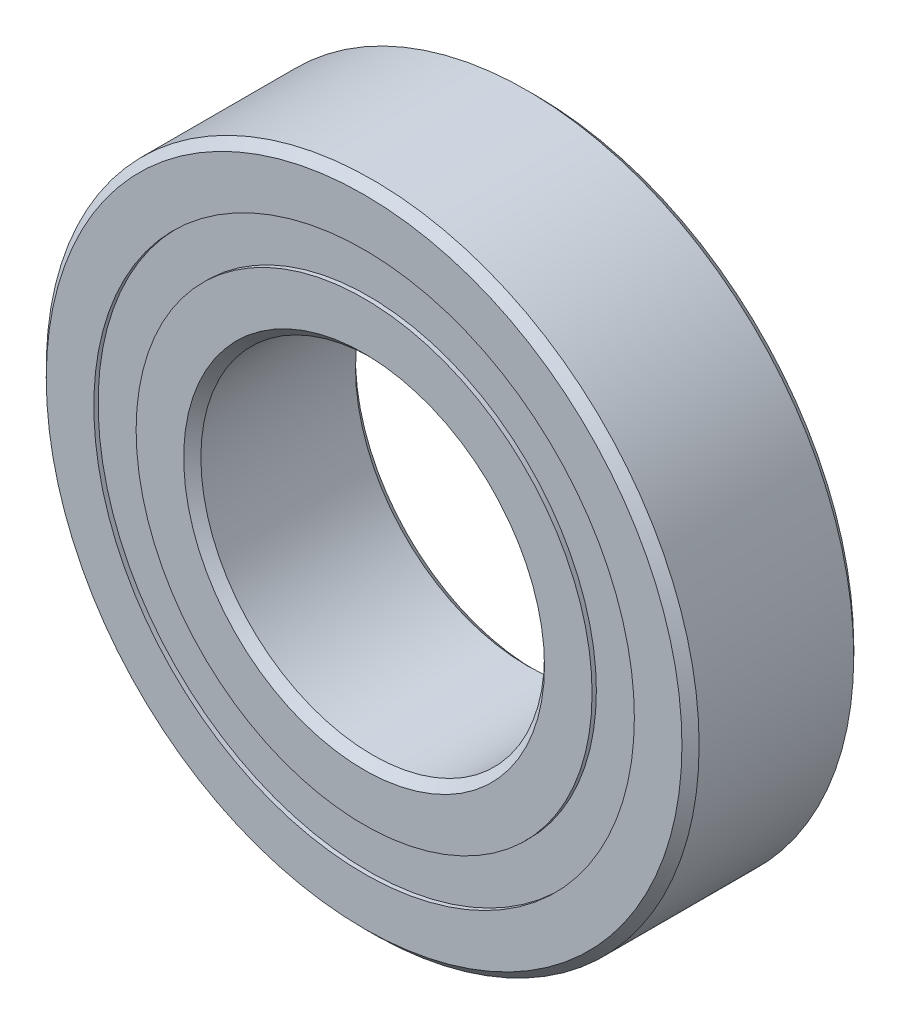
ISO-10303-21;
HEADER;
FILE_DESCRIPTION(('STEP AP214'),'2;1');
FILE_NAME('part.step','',(''),(''),'','','');
FILE_SCHEMA(('AUTOMOTIVE_DESIGN { 1 0 10303 214 1 1 1 1 }'));
ENDSEC;
DATA;
#1=APPLICATION_CONTEXT('core data for automotive mechanical design processes');
#2=APPLICATION_PROTOCOL_DEFINITION('international standard','automotive_design',2000,#1);
#3=PRODUCT_CONTEXT('',#1,'mechanical');
#4=PRODUCT('Part','Part','',(#3));
#5=PRODUCT_RELATED_PRODUCT_CATEGORY('part','',(#4));
#6=PRODUCT_DEFINITION_FORMATION('','',#4);
#7=PRODUCT_DEFINITION_CONTEXT('part definition',#1,'design');
#8=PRODUCT_DEFINITION('design','',#6,#7);
#9=PRODUCT_DEFINITION_SHAPE('','',#8);
#10=(LENGTH_UNIT() NAMED_UNIT(*) SI_UNIT(.MILLI.,.METRE.));
#11=(NAMED_UNIT(*) PLANE_ANGLE_UNIT() SI_UNIT($,.RADIAN.));
#12=(NAMED_UNIT(*) SI_UNIT($,.STERADIAN.) SOLID_ANGLE_UNIT());
#13=UNCERTAINTY_MEASURE_WITH_UNIT(LENGTH_MEASURE(1.E-05),#10,'distance_accuracy_value','');
#14=(GEOMETRIC_REPRESENTATION_CONTEXT(3) GLOBAL_UNCERTAINTY_ASSIGNED_CONTEXT((#13)) GLOBAL_UNIT_ASSIGNED_CONTEXT((#10,
#11,#12)) REPRESENTATION_CONTEXT('',''));
#15=CARTESIAN_POINT('',(0.,0.,0.));
#16=DIRECTION('',(0.,0.,1.));
#17=DIRECTION('',(1.,0.,0.));
#18=AXIS2_PLACEMENT_3D('',#15,#16,#17);
#19=CARTESIAN_POINT('',(0.,7.86538461538461,-2.375));
#20=DIRECTION('',(0.,0.,1.));
#21=DIRECTION('',(1.,0.,0.));
#22=AXIS2_PLACEMENT_3D('',#19,#20,#21);
#23=PLANE('',#22);
#24=CARTESIAN_POINT('',(0.,0.,-2.375));
#25=DIRECTION('',(0.,0.,1.));
#26=DIRECTION('',(1.,0.,0.));
#27=AXIS2_PLACEMENT_3D('',#24,#25,#26);
#28=CIRCLE('',#27,7.86538461538461);
#29=CARTESIAN_POINT('',(7.86538461538461,0.,-2.375));
#30=VERTEX_POINT('',#29);
#31=EDGE_CURVE('E61',#30,#30,#28,.T.);
#32=ORIENTED_EDGE('',*,*,#31,.F.);
#33=EDGE_LOOP('',(#32));
#34=FACE_BOUND('',#33,.T.);
#35=CARTESIAN_POINT('',(0.,0.,-2.375));
#36=DIRECTION('',(0.,0.,1.));
#37=DIRECTION('',(1.,0.,0.));
#38=AXIS2_PLACEMENT_3D('',#35,#36,#37);
#39=CIRCLE('',#38,6.63461538461539);
#40=CARTESIAN_POINT('',(6.63461538461539,0.,-2.375));
#41=VERTEX_POINT('',#40);
#42=EDGE_CURVE('E11',#41,#41,#39,.T.);
#43=ORIENTED_EDGE('',*,*,#42,.T.);
#44=EDGE_LOOP('',(#43));
#45=FACE_BOUND('',#44,.T.);
#46=ADVANCED_FACE('F47',(#34,#45),#23,.F.);
#47=CARTESIAN_POINT('',(0.,0.,2.5));
#48=DIRECTION('',(0.,0.,1.));
#49=DIRECTION('',(1.,0.,0.));
#50=AXIS2_PLACEMENT_3D('',#47,#48,#49);
#51=CYLINDRICAL_SURFACE('',#50,6.63461538461539);
#52=ORIENTED_EDGE('',*,*,#42,.F.);
#53=EDGE_LOOP('',(#52));
#54=FACE_BOUND('',#53,.T.);
#55=CARTESIAN_POINT('',(0.,0.,-1.2701441359494));
#56=DIRECTION('',(0.,0.,1.));
#57=DIRECTION('',(1.,0.,0.));
#58=AXIS2_PLACEMENT_3D('',#55,#56,#57);
#59=CIRCLE('',#58,6.63461538461539);
#60=CARTESIAN_POINT('',(6.63461538461539,0.,-1.2701441359494));
#61=VERTEX_POINT('',#60);
#62=EDGE_CURVE('E53',#61,#61,#59,.T.);
#63=ORIENTED_EDGE('',*,*,#62,.T.);
#64=EDGE_LOOP('',(#63));
#65=FACE_BOUND('',#64,.T.);
#66=ADVANCED_FACE('F70',(#54,#65),#51,.F.);
#67=CARTESIAN_POINT('',(0.,7.86538461538461,-1.2701441359494));
#68=DIRECTION('',(0.,0.,-1.));
#69=DIRECTION('',(-1.,0.,0.));
#70=AXIS2_PLACEMENT_3D('',#67,#68,#69);
#71=PLANE('',#70);
#72=ORIENTED_EDGE('',*,*,#62,.F.);
#73=EDGE_LOOP('',(#72));
#74=FACE_BOUND('',#73,.T.);
#75=CARTESIAN_POINT('',(0.,0.,-1.2701441359494));
#76=DIRECTION('',(0.,0.,1.));
#77=DIRECTION('',(1.,0.,0.));
#78=AXIS2_PLACEMENT_3D('',#75,#76,#77);
#79=CIRCLE('',#78,7.86538461538461);
#80=CARTESIAN_POINT('',(7.86538461538461,0.,-1.2701441359494));
#81=VERTEX_POINT('',#80);
#82=EDGE_CURVE('E57',#81,#81,#79,.T.);
#83=ORIENTED_EDGE('',*,*,#82,.T.);
#84=EDGE_LOOP('',(#83));
#85=FACE_BOUND('',#84,.T.);
#86=ADVANCED_FACE('F74',(#74,#85),#71,.F.);
#87=CARTESIAN_POINT('',(0.,0.,2.5));
#88=DIRECTION('',(0.,0.,1.));
#89=DIRECTION('',(1.,0.,0.));
#90=AXIS2_PLACEMENT_3D('',#87,#88,#89);
#91=CYLINDRICAL_SURFACE('',#90,7.86538461538461);
#92=ORIENTED_EDGE('',*,*,#82,.F.);
#93=EDGE_LOOP('',(#92));
#94=FACE_BOUND('',#93,.T.);
#95=ORIENTED_EDGE('',*,*,#31,.T.);
#96=EDGE_LOOP('',(#95));
#97=FACE_BOUND('',#96,.T.);
#98=ADVANCED_FACE('F67',(#94,#97),#91,.T.);
#99=CLOSED_SHELL('',(#46,#66,#86,#98));
#100=MANIFOLD_SOLID_BREP('B2',#99);
#101=CARTESIAN_POINT('',(0.,7.86538461538461,2.375));
#102=DIRECTION('',(0.,0.,-1.));
#103=DIRECTION('',(-1.,0.,0.));
#104=AXIS2_PLACEMENT_3D('',#101,#102,#103);
#105=PLANE('',#104);
#106=CARTESIAN_POINT('',(0.,0.,2.375));
#107=DIRECTION('',(0.,0.,1.));
#108=DIRECTION('',(1.,0.,0.));
#109=AXIS2_PLACEMENT_3D('',#106,#107,#108);
#110=CIRCLE('',#109,6.63461538461539);
#111=CARTESIAN_POINT('',(6.63461538461539,0.,2.375));
#112=VERTEX_POINT('',#111);
#113=EDGE_CURVE('E46',#112,#112,#110,.T.);
#114=ORIENTED_EDGE('',*,*,#113,.F.);
#115=EDGE_LOOP('',(#114));
#116=FACE_BOUND('',#115,.T.);
#117=CARTESIAN_POINT('',(0.,0.,2.375));
#118=DIRECTION('',(0.,0.,1.));
#119=DIRECTION('',(1.,0.,0.));
#120=AXIS2_PLACEMENT_3D('',#117,#118,#119);
#121=CIRCLE('',#120,7.86538461538461);
#122=CARTESIAN_POINT('',(7.86538461538461,0.,2.375));
#123=VERTEX_POINT('',#122);
#124=EDGE_CURVE('E152',#123,#123,#121,.T.);
#125=ORIENTED_EDGE('',*,*,#124,.T.);
#126=EDGE_LOOP('',(#125));
#127=FACE_BOUND('',#126,.T.);
#128=ADVANCED_FACE('F138',(#116,#127),#105,.F.);
#129=CARTESIAN_POINT('',(0.,0.,2.5));
#130=DIRECTION('',(0.,0.,1.));
#131=DIRECTION('',(1.,0.,0.));
#132=AXIS2_PLACEMENT_3D('',#129,#130,#131);
#133=CYLINDRICAL_SURFACE('',#132,6.63461538461539);
#134=CARTESIAN_POINT('',(0.,0.,1.27014413594939));
#135=DIRECTION('',(0.,0.,1.));
#136=DIRECTION('',(1.,0.,0.));
#137=AXIS2_PLACEMENT_3D('',#134,#135,#136);
#138=CIRCLE('',#137,6.63461538461539);
#139=CARTESIAN_POINT('',(6.63461538461539,0.,1.27014413594939));
#140=VERTEX_POINT('',#139);
#141=EDGE_CURVE('E144',#140,#140,#138,.T.);
#142=ORIENTED_EDGE('',*,*,#141,.F.);
#143=EDGE_LOOP('',(#142));
#144=FACE_BOUND('',#143,.T.);
#145=ORIENTED_EDGE('',*,*,#113,.T.);
#146=EDGE_LOOP('',(#145));
#147=FACE_BOUND('',#146,.T.);
#148=ADVANCED_FACE('F167',(#144,#147),#133,.F.);
#149=CARTESIAN_POINT('',(0.,7.86538461538461,1.27014413594939));
#150=DIRECTION('',(0.,0.,1.));
#151=DIRECTION('',(1.,0.,0.));
#152=AXIS2_PLACEMENT_3D('',#149,#150,#151);
#153=PLANE('',#152);
#154=CARTESIAN_POINT('',(0.,0.,1.27014413594939));
#155=DIRECTION('',(0.,0.,1.));
#156=DIRECTION('',(1.,0.,0.));
#157=AXIS2_PLACEMENT_3D('',#154,#155,#156);
#158=CIRCLE('',#157,7.86538461538461);
#159=CARTESIAN_POINT('',(7.86538461538461,0.,1.27014413594939));
#160=VERTEX_POINT('',#159);
#161=EDGE_CURVE('E148',#160,#160,#158,.T.);
#162=ORIENTED_EDGE('',*,*,#161,.F.);
#163=EDGE_LOOP('',(#162));
#164=FACE_BOUND('',#163,.T.);
#165=ORIENTED_EDGE('',*,*,#141,.T.);
#166=EDGE_LOOP('',(#165));
#167=FACE_BOUND('',#166,.T.);
#168=ADVANCED_FACE('F162',(#164,#167),#153,.F.);
#169=CARTESIAN_POINT('',(0.,0.,2.5));
#170=DIRECTION('',(0.,0.,1.));
#171=DIRECTION('',(1.,0.,0.));
#172=AXIS2_PLACEMENT_3D('',#169,#170,#171);
#173=CYLINDRICAL_SURFACE('',#172,7.86538461538461);
#174=ORIENTED_EDGE('',*,*,#124,.F.);
#175=EDGE_LOOP('',(#174));
#176=FACE_BOUND('',#175,.T.);
#177=ORIENTED_EDGE('',*,*,#161,.T.);
#178=EDGE_LOOP('',(#177));
#179=FACE_BOUND('',#178,.T.);
#180=ADVANCED_FACE('F159',(#176,#179),#173,.T.);
#181=CLOSED_SHELL('',(#128,#148,#168,#180));
#182=MANIFOLD_SOLID_BREP('B6',#181);
#183=CARTESIAN_POINT('',(-3.62499999999992,6.27868417743723,0.));
#184=DIRECTION('',(0.,0.,1.));
#185=DIRECTION('',(0.499999999999989,-0.866025403784445,0.));
#186=AXIS2_PLACEMENT_3D('',#183,#184,#185);
#187=SPHERICAL_SURFACE('',#186,1.2701441359494);
#188=CARTESIAN_POINT('',(-3.62499999999992,6.27868417743723,1.27014413594939));
#189=VERTEX_POINT('',#188);
#190=VERTEX_LOOP('',#189);
#191=FACE_BOUND('',#190,.T.);
#192=ADVANCED_FACE('F229',(#191),#187,.T.);
#193=CLOSED_SHELL('',(#192));
#194=MANIFOLD_SOLID_BREP('B41',#193);
#195=CARTESIAN_POINT('',(-6.27868417743714,3.62500000000007,0.));
#196=DIRECTION('',(0.,0.,1.));
#197=DIRECTION('',(0.866025403784433,-0.50000000000001,0.));
#198=AXIS2_PLACEMENT_3D('',#195,#196,#197);
#199=SPHERICAL_SURFACE('',#198,1.2701441359494);
#200=CARTESIAN_POINT('',(-6.27868417743714,3.62500000000007,1.27014413594939));
#201=VERTEX_POINT('',#200);
#202=VERTEX_LOOP('',#201);
#203=FACE_BOUND('',#202,.T.);
#204=ADVANCED_FACE('F255',(#203),#199,.T.);
#205=CLOSED_SHELL('',(#204));
#206=MANIFOLD_SOLID_BREP('B134',#205);
#207=CARTESIAN_POINT('',(-7.25,0.,0.));
#208=DIRECTION('',(0.,0.,1.));
#209=DIRECTION('',(1.,0.,0.));
#210=AXIS2_PLACEMENT_3D('',#207,#208,#209);
#211=SPHERICAL_SURFACE('',#210,1.2701441359494);
#212=CARTESIAN_POINT('',(-7.25,0.,1.27014413594939));
#213=VERTEX_POINT('',#212);
#214=VERTEX_LOOP('',#213);
#215=FACE_BOUND('',#214,.T.);
#216=ADVANCED_FACE('F281',(#215),#211,.T.);
#217=CLOSED_SHELL('',(#216));
#218=MANIFOLD_SOLID_BREP('B225',#217);
#219=CARTESIAN_POINT('',(-6.27868417743721,-3.62499999999994,0.));
#220=DIRECTION('',(0.,0.,1.));
#221=DIRECTION('',(0.866025403784443,0.499999999999992,0.));
#222=AXIS2_PLACEMENT_3D('',#219,#220,#221);
#223=SPHERICAL_SURFACE('',#222,1.2701441359494);
#224=CARTESIAN_POINT('',(-6.27868417743721,-3.62499999999994,1.27014413594939));
#225=VERTEX_POINT('',#224);
#226=VERTEX_LOOP('',#225);
#227=FACE_BOUND('',#226,.T.);
#228=ADVANCED_FACE('F307',(#227),#223,.T.);
#229=CLOSED_SHELL('',(#228));
#230=MANIFOLD_SOLID_BREP('B251',#229);
#231=CARTESIAN_POINT('',(-3.62500000000005,-6.27868417743715,0.));
#232=DIRECTION('',(0.,0.,1.));
#233=DIRECTION('',(0.500000000000007,0.866025403784435,0.));
#234=AXIS2_PLACEMENT_3D('',#231,#232,#233);
#235=SPHERICAL_SURFACE('',#234,1.2701441359494);
#236=CARTESIAN_POINT('',(-3.62500000000005,-6.27868417743715,1.27014413594939));
#237=VERTEX_POINT('',#236);
#238=VERTEX_LOOP('',#237);
#239=FACE_BOUND('',#238,.T.);
#240=ADVANCED_FACE('F333',(#239),#235,.T.);
#241=CLOSED_SHELL('',(#240));
#242=MANIFOLD_SOLID_BREP('B277',#241);
#243=CARTESIAN_POINT('',(0.,-7.25,0.));
#244=DIRECTION('',(0.,0.,1.));
#245=DIRECTION('',(0.,1.,0.));
#246=AXIS2_PLACEMENT_3D('',#243,#244,#245);
#247=SPHERICAL_SURFACE('',#246,1.2701441359494);
#248=CARTESIAN_POINT('',(0.,-7.25,1.27014413594939));
#249=VERTEX_POINT('',#248);
#250=VERTEX_LOOP('',#249);
#251=FACE_BOUND('',#250,.T.);
#252=ADVANCED_FACE('F359',(#251),#247,.T.);
#253=CLOSED_SHELL('',(#252));
#254=MANIFOLD_SOLID_BREP('B303',#253);
#255=CARTESIAN_POINT('',(3.62499999999996,-6.2786841774372,0.));
#256=DIRECTION('',(0.,0.,1.));
#257=DIRECTION('',(-0.499999999999995,0.866025403784442,0.));
#258=AXIS2_PLACEMENT_3D('',#255,#256,#257);
#259=SPHERICAL_SURFACE('',#258,1.2701441359494);
#260=CARTESIAN_POINT('',(3.62499999999996,-6.2786841774372,1.27014413594939));
#261=VERTEX_POINT('',#260);
#262=VERTEX_LOOP('',#261);
#263=FACE_BOUND('',#262,.T.);
#264=ADVANCED_FACE('F385',(#263),#259,.T.);
#265=CLOSED_SHELL('',(#264));
#266=MANIFOLD_SOLID_BREP('B329',#265);
#267=CARTESIAN_POINT('',(6.27868417743717,-3.62500000000003,0.));
#268=DIRECTION('',(0.,0.,1.));
#269=DIRECTION('',(-0.866025403784436,0.500000000000004,0.));
#270=AXIS2_PLACEMENT_3D('',#267,#268,#269);
#271=SPHERICAL_SURFACE('',#270,1.2701441359494);
#272=CARTESIAN_POINT('',(6.27868417743717,-3.62500000000003,1.27014413594939));
#273=VERTEX_POINT('',#272);
#274=VERTEX_LOOP('',#273);
#275=FACE_BOUND('',#274,.T.);
#276=ADVANCED_FACE('F411',(#275),#271,.T.);
#277=CLOSED_SHELL('',(#276));
#278=MANIFOLD_SOLID_BREP('B355',#277);
#279=CARTESIAN_POINT('',(7.25,0.,0.));
#280=DIRECTION('',(0.,0.,1.));
#281=DIRECTION('',(-1.,0.,0.));
#282=AXIS2_PLACEMENT_3D('',#279,#280,#281);
#283=SPHERICAL_SURFACE('',#282,1.2701441359494);
#284=CARTESIAN_POINT('',(7.25,0.,1.27014413594939));
#285=VERTEX_POINT('',#284);
#286=VERTEX_LOOP('',#285);
#287=FACE_BOUND('',#286,.T.);
#288=ADVANCED_FACE('F437',(#287),#283,.T.);
#289=CLOSED_SHELL('',(#288));
#290=MANIFOLD_SOLID_BREP('B381',#289);
#291=CARTESIAN_POINT('',(6.27868417743719,3.62499999999999,0.));
#292=DIRECTION('',(0.,0.,1.));
#293=DIRECTION('',(-0.86602540378444,-0.499999999999998,0.));
#294=AXIS2_PLACEMENT_3D('',#291,#292,#293);
#295=SPHERICAL_SURFACE('',#294,1.2701441359494);
#296=CARTESIAN_POINT('',(6.27868417743719,3.62499999999999,1.27014413594939));
#297=VERTEX_POINT('',#296);
#298=VERTEX_LOOP('',#297);
#299=FACE_BOUND('',#298,.T.);
#300=ADVANCED_FACE('F463',(#299),#295,.T.);
#301=CLOSED_SHELL('',(#300));
#302=MANIFOLD_SOLID_BREP('B407',#301);
#303=CARTESIAN_POINT('',(3.62500000000001,6.27868417743718,0.));
#304=DIRECTION('',(0.,0.,1.));
#305=DIRECTION('',(-0.500000000000001,-0.866025403784438,0.));
#306=AXIS2_PLACEMENT_3D('',#303,#304,#305);
#307=SPHERICAL_SURFACE('',#306,1.2701441359494);
#308=CARTESIAN_POINT('',(3.62500000000001,6.27868417743718,1.27014413594939));
#309=VERTEX_POINT('',#308);
#310=VERTEX_LOOP('',#309);
#311=FACE_BOUND('',#310,.T.);
#312=ADVANCED_FACE('F489',(#311),#307,.T.);
#313=CLOSED_SHELL('',(#312));
#314=MANIFOLD_SOLID_BREP('B433',#313);
#315=CARTESIAN_POINT('',(0.,7.25,0.));
#316=DIRECTION('',(0.,0.,1.));
#317=DIRECTION('',(0.,-1.,0.));
#318=AXIS2_PLACEMENT_3D('',#315,#316,#317);
#319=SPHERICAL_SURFACE('',#318,1.2701441359494);
#320=CARTESIAN_POINT('',(0.,7.25,1.27014413594939));
#321=VERTEX_POINT('',#320);
#322=VERTEX_LOOP('',#321);
#323=FACE_BOUND('',#322,.T.);
#324=ADVANCED_FACE('F517',(#323),#319,.T.);
#325=CLOSED_SHELL('',(#324));
#326=MANIFOLD_SOLID_BREP('B459',#325);
#327=CARTESIAN_POINT('',(0.,6.63461538461539,2.5));
#328=DIRECTION('',(0.,0.,-1.));
#329=DIRECTION('',(-1.,0.,0.));
#330=AXIS2_PLACEMENT_3D('',#327,#328,#329);
#331=PLANE('',#330);
#332=CARTESIAN_POINT('',(0.,0.,2.5));
#333=DIRECTION('',(0.,0.,1.));
#334=DIRECTION('',(1.,0.,0.));
#335=AXIS2_PLACEMENT_3D('',#332,#333,#334);
#336=CIRCLE('',#335,5.25);
#337=CARTESIAN_POINT('',(5.25,0.,2.5));
#338=VERTEX_POINT('',#337);
#339=EDGE_CURVE('E570',#338,#338,#336,.T.);
#340=ORIENTED_EDGE('',*,*,#339,.F.);
#341=EDGE_LOOP('',(#340));
#342=FACE_BOUND('',#341,.T.);
#343=CARTESIAN_POINT('',(0.,0.,2.5));
#344=DIRECTION('',(0.,0.,1.));
#345=DIRECTION('',(1.,0.,0.));
#346=AXIS2_PLACEMENT_3D('',#343,#344,#345);
#347=CIRCLE('',#346,6.63461538461539);
#348=CARTESIAN_POINT('',(6.63461538461539,0.,2.5));
#349=VERTEX_POINT('',#348);
#350=EDGE_CURVE('E516',#349,#349,#347,.T.);
#351=ORIENTED_EDGE('',*,*,#350,.T.);
#352=EDGE_LOOP('',(#351));
#353=FACE_BOUND('',#352,.T.);
#354=ADVANCED_FACE('F542',(#342,#353),#331,.F.);
#355=CARTESIAN_POINT('',(0.,0.,2.5));
#356=DIRECTION('',(0.,0.,1.));
#357=DIRECTION('',(1.,0.,0.));
#358=AXIS2_PLACEMENT_3D('',#355,#356,#357);
#359=CYLINDRICAL_SURFACE('',#358,6.63461538461539);
#360=ORIENTED_EDGE('',*,*,#350,.F.);
#361=EDGE_LOOP('',(#360));
#362=FACE_BOUND('',#361,.T.);
#363=CARTESIAN_POINT('',(0.,0.,1.11111111111111));
#364=DIRECTION('',(0.,0.,1.));
#365=DIRECTION('',(1.,0.,0.));
#366=AXIS2_PLACEMENT_3D('',#363,#364,#365);
#367=CIRCLE('',#366,6.63461538461539);
#368=CARTESIAN_POINT('',(6.63461538461539,0.,1.11111111111111));
#369=VERTEX_POINT('',#368);
#370=EDGE_CURVE('E548',#369,#369,#367,.T.);
#371=ORIENTED_EDGE('',*,*,#370,.T.);
#372=EDGE_LOOP('',(#371));
#373=FACE_BOUND('',#372,.T.);
#374=ADVANCED_FACE('F577',(#362,#373),#359,.T.);
#375=CARTESIAN_POINT('',(0.,0.,0.));
#376=DIRECTION('',(0.,0.,1.));
#377=DIRECTION('',(1.,0.,0.));
#378=AXIS2_PLACEMENT_3D('',#375,#376,#377);
#379=TOROIDAL_SURFACE('',#378,7.24999999999999,1.27014413594939);
#380=ORIENTED_EDGE('',*,*,#370,.F.);
#381=EDGE_LOOP('',(#380));
#382=FACE_BOUND('',#381,.T.);
#383=CARTESIAN_POINT('',(0.,0.,-1.11111111111111));
#384=DIRECTION('',(0.,0.,1.));
#385=DIRECTION('',(1.,0.,0.));
#386=AXIS2_PLACEMENT_3D('',#383,#384,#385);
#387=CIRCLE('',#386,6.63461538461538);
#388=CARTESIAN_POINT('',(6.63461538461538,0.,-1.11111111111111));
#389=VERTEX_POINT('',#388);
#390=EDGE_CURVE('E552',#389,#389,#387,.T.);
#391=ORIENTED_EDGE('',*,*,#390,.T.);
#392=EDGE_LOOP('',(#391));
#393=FACE_BOUND('',#392,.T.);
#394=ADVANCED_FACE('F581',(#382,#393),#379,.F.);
#395=CARTESIAN_POINT('',(0.,0.,2.5));
#396=DIRECTION('',(0.,0.,1.));
#397=DIRECTION('',(1.,0.,0.));
#398=AXIS2_PLACEMENT_3D('',#395,#396,#397);
#399=CYLINDRICAL_SURFACE('',#398,6.63461538461538);
#400=ORIENTED_EDGE('',*,*,#390,.F.);
#401=EDGE_LOOP('',(#400));
#402=FACE_BOUND('',#401,.T.);
#403=CARTESIAN_POINT('',(0.,0.,-2.5));
#404=DIRECTION('',(0.,0.,1.));
#405=DIRECTION('',(1.,0.,0.));
#406=AXIS2_PLACEMENT_3D('',#403,#404,#405);
#407=CIRCLE('',#406,6.63461538461539);
#408=CARTESIAN_POINT('',(6.63461538461539,0.,-2.5));
#409=VERTEX_POINT('',#408);
#410=EDGE_CURVE('E556',#409,#409,#407,.T.);
#411=ORIENTED_EDGE('',*,*,#410,.T.);
#412=EDGE_LOOP('',(#411));
#413=FACE_BOUND('',#412,.T.);
#414=ADVANCED_FACE('F586',(#402,#413),#399,.T.);
#415=CARTESIAN_POINT('',(0.,5.25,-2.5));
#416=DIRECTION('',(0.,0.,1.));
#417=DIRECTION('',(1.,0.,0.));
#418=AXIS2_PLACEMENT_3D('',#415,#416,#417);
#419=PLANE('',#418);
#420=ORIENTED_EDGE('',*,*,#410,.F.);
#421=EDGE_LOOP('',(#420));
#422=FACE_BOUND('',#421,.T.);
#423=CARTESIAN_POINT('',(0.,0.,-2.5));
#424=DIRECTION('',(0.,0.,1.));
#425=DIRECTION('',(1.,0.,0.));
#426=AXIS2_PLACEMENT_3D('',#423,#424,#425);
#427=CIRCLE('',#426,5.25);
#428=CARTESIAN_POINT('',(5.25,0.,-2.5));
#429=VERTEX_POINT('',#428);
#430=EDGE_CURVE('E561',#429,#429,#427,.T.);
#431=ORIENTED_EDGE('',*,*,#430,.T.);
#432=EDGE_LOOP('',(#431));
#433=FACE_BOUND('',#432,.T.);
#434=ADVANCED_FACE('F592',(#422,#433),#419,.F.);
#435=CARTESIAN_POINT('',(0.,0.,-2.25));
#436=DIRECTION('',(0.,0.,-1.));
#437=DIRECTION('',(-1.,0.,0.));
#438=AXIS2_PLACEMENT_3D('',#435,#436,#437);
#439=CONICAL_SURFACE('',#438,5.,0.785398163397448);
#440=ORIENTED_EDGE('',*,*,#430,.F.);
#441=EDGE_LOOP('',(#440));
#442=FACE_BOUND('',#441,.T.);
#443=CARTESIAN_POINT('',(0.,0.,-2.25));
#444=DIRECTION('',(0.,0.,1.));
#445=DIRECTION('',(1.,0.,0.));
#446=AXIS2_PLACEMENT_3D('',#443,#444,#445);
#447=CIRCLE('',#446,5.);
#448=CARTESIAN_POINT('',(5.,0.,-2.25));
#449=VERTEX_POINT('',#448);
#450=EDGE_CURVE('E564',#449,#449,#447,.T.);
#451=ORIENTED_EDGE('',*,*,#450,.T.);
#452=EDGE_LOOP('',(#451));
#453=FACE_BOUND('',#452,.T.);
#454=ADVANCED_FACE('F596',(#442,#453),#439,.F.);
#455=CARTESIAN_POINT('',(0.,0.,2.5));
#456=DIRECTION('',(0.,0.,1.));
#457=DIRECTION('',(1.,0.,0.));
#458=AXIS2_PLACEMENT_3D('',#455,#456,#457);
#459=CYLINDRICAL_SURFACE('',#458,5.);
#460=ORIENTED_EDGE('',*,*,#450,.F.);
#461=EDGE_LOOP('',(#460));
#462=FACE_BOUND('',#461,.T.);
#463=CARTESIAN_POINT('',(0.,0.,2.25));
#464=DIRECTION('',(0.,0.,1.));
#465=DIRECTION('',(1.,0.,0.));
#466=AXIS2_PLACEMENT_3D('',#463,#464,#465);
#467=CIRCLE('',#466,5.);
#468=CARTESIAN_POINT('',(5.,0.,2.25));
#469=VERTEX_POINT('',#468);
#470=EDGE_CURVE('E567',#469,#469,#467,.T.);
#471=ORIENTED_EDGE('',*,*,#470,.T.);
#472=EDGE_LOOP('',(#471));
#473=FACE_BOUND('',#472,.T.);
#474=ADVANCED_FACE('F600',(#462,#473),#459,.F.);
#475=CARTESIAN_POINT('',(0.,0.,2.5));
#476=DIRECTION('',(0.,0.,1.));
#477=DIRECTION('',(1.,0.,0.));
#478=AXIS2_PLACEMENT_3D('',#475,#476,#477);
#479=CONICAL_SURFACE('',#478,5.25,0.785398163397449);
#480=ORIENTED_EDGE('',*,*,#470,.F.);
#481=EDGE_LOOP('',(#480));
#482=FACE_BOUND('',#481,.T.);
#483=ORIENTED_EDGE('',*,*,#339,.T.);
#484=EDGE_LOOP('',(#483));
#485=FACE_BOUND('',#484,.T.);
#486=ADVANCED_FACE('F574',(#482,#485),#479,.F.);
#487=CLOSED_SHELL('',(#354,#374,#394,#414,#434,#454,#474,#486));
#488=MANIFOLD_SOLID_BREP('B485',#487);
#489=CARTESIAN_POINT('',(0.,0.,2.25));
#490=DIRECTION('',(0.,0.,-1.));
#491=DIRECTION('',(-1.,0.,0.));
#492=AXIS2_PLACEMENT_3D('',#489,#490,#491);
#493=CONICAL_SURFACE('',#492,9.5,0.785398163397449);
#494=CARTESIAN_POINT('',(0.,0.,2.5));
#495=DIRECTION('',(0.,0.,1.));
#496=DIRECTION('',(1.,0.,0.));
#497=AXIS2_PLACEMENT_3D('',#494,#495,#496);
#498=CIRCLE('',#497,9.25);
#499=CARTESIAN_POINT('',(9.25,0.,2.5));
#500=VERTEX_POINT('',#499);
#501=EDGE_CURVE('E739',#500,#500,#498,.T.);
#502=ORIENTED_EDGE('',*,*,#501,.F.);
#503=EDGE_LOOP('',(#502));
#504=FACE_BOUND('',#503,.T.);
#505=CARTESIAN_POINT('',(0.,0.,2.25));
#506=DIRECTION('',(0.,0.,1.));
#507=DIRECTION('',(1.,0.,0.));
#508=AXIS2_PLACEMENT_3D('',#505,#506,#507);
#509=CIRCLE('',#508,9.5);
#510=CARTESIAN_POINT('',(9.5,0.,2.25));
#511=VERTEX_POINT('',#510);
#512=EDGE_CURVE('E541',#511,#511,#509,.T.);
#513=ORIENTED_EDGE('',*,*,#512,.T.);
#514=EDGE_LOOP('',(#513));
#515=FACE_BOUND('',#514,.T.);
#516=ADVANCED_FACE('F711',(#504,#515),#493,.T.);
#517=CARTESIAN_POINT('',(0.,0.,2.5));
#518=DIRECTION('',(0.,0.,1.));
#519=DIRECTION('',(1.,0.,0.));
#520=AXIS2_PLACEMENT_3D('',#517,#518,#519);
#521=CYLINDRICAL_SURFACE('',#520,9.5);
#522=ORIENTED_EDGE('',*,*,#512,.F.);
#523=EDGE_LOOP('',(#522));
#524=FACE_BOUND('',#523,.T.);
#525=CARTESIAN_POINT('',(0.,0.,-2.25));
#526=DIRECTION('',(0.,0.,1.));
#527=DIRECTION('',(1.,0.,0.));
#528=AXIS2_PLACEMENT_3D('',#525,#526,#527);
#529=CIRCLE('',#528,9.5);
#530=CARTESIAN_POINT('',(9.5,0.,-2.25));
#531=VERTEX_POINT('',#530);
#532=EDGE_CURVE('E717',#531,#531,#529,.T.);
#533=ORIENTED_EDGE('',*,*,#532,.T.);
#534=EDGE_LOOP('',(#533));
#535=FACE_BOUND('',#534,.T.);
#536=ADVANCED_FACE('F746',(#524,#535),#521,.T.);
#537=CARTESIAN_POINT('',(0.,0.,-2.5));
#538=DIRECTION('',(0.,0.,1.));
#539=DIRECTION('',(1.,0.,0.));
#540=AXIS2_PLACEMENT_3D('',#537,#538,#539);
#541=CONICAL_SURFACE('',#540,9.25,0.785398163397448);
#542=ORIENTED_EDGE('',*,*,#532,.F.);
#543=EDGE_LOOP('',(#542));
#544=FACE_BOUND('',#543,.T.);
#545=CARTESIAN_POINT('',(0.,0.,-2.5));
#546=DIRECTION('',(0.,0.,1.));
#547=DIRECTION('',(1.,0.,0.));
#548=AXIS2_PLACEMENT_3D('',#545,#546,#547);
#549=CIRCLE('',#548,9.25);
#550=CARTESIAN_POINT('',(9.25,0.,-2.5));
#551=VERTEX_POINT('',#550);
#552=EDGE_CURVE('E721',#551,#551,#549,.T.);
#553=ORIENTED_EDGE('',*,*,#552,.T.);
#554=EDGE_LOOP('',(#553));
#555=FACE_BOUND('',#554,.T.);
#556=ADVANCED_FACE('F750',(#544,#555),#541,.T.);
#557=CARTESIAN_POINT('',(0.,9.25,-2.5));
#558=DIRECTION('',(0.,0.,1.));
#559=DIRECTION('',(1.,0.,0.));
#560=AXIS2_PLACEMENT_3D('',#557,#558,#559);
#561=PLANE('',#560);
#562=ORIENTED_EDGE('',*,*,#552,.F.);
#563=EDGE_LOOP('',(#562));
#564=FACE_BOUND('',#563,.T.);
#565=CARTESIAN_POINT('',(0.,0.,-2.5));
#566=DIRECTION('',(0.,0.,1.));
#567=DIRECTION('',(1.,0.,0.));
#568=AXIS2_PLACEMENT_3D('',#565,#566,#567);
#569=CIRCLE('',#568,7.86538461538461);
#570=CARTESIAN_POINT('',(7.86538461538461,0.,-2.5));
#571=VERTEX_POINT('',#570);
#572=EDGE_CURVE('E725',#571,#571,#569,.T.);
#573=ORIENTED_EDGE('',*,*,#572,.T.);
#574=EDGE_LOOP('',(#573));
#575=FACE_BOUND('',#574,.T.);
#576=ADVANCED_FACE('F755',(#564,#575),#561,.F.);
#577=CARTESIAN_POINT('',(0.,0.,2.5));
#578=DIRECTION('',(0.,0.,1.));
#579=DIRECTION('',(1.,0.,0.));
#580=AXIS2_PLACEMENT_3D('',#577,#578,#579);
#581=CYLINDRICAL_SURFACE('',#580,7.86538461538461);
#582=ORIENTED_EDGE('',*,*,#572,.F.);
#583=EDGE_LOOP('',(#582));
#584=FACE_BOUND('',#583,.T.);
#585=CARTESIAN_POINT('',(0.,0.,-1.11111111111111));
#586=DIRECTION('',(0.,0.,1.));
#587=DIRECTION('',(1.,0.,0.));
#588=AXIS2_PLACEMENT_3D('',#585,#586,#587);
#589=CIRCLE('',#588,7.86538461538461);
#590=CARTESIAN_POINT('',(7.86538461538461,0.,-1.11111111111111));
#591=VERTEX_POINT('',#590);
#592=EDGE_CURVE('E730',#591,#591,#589,.T.);
#593=ORIENTED_EDGE('',*,*,#592,.T.);
#594=EDGE_LOOP('',(#593));
#595=FACE_BOUND('',#594,.T.);
#596=ADVANCED_FACE('F761',(#584,#595),#581,.F.);
#597=CARTESIAN_POINT('',(0.,0.,0.));
#598=DIRECTION('',(0.,0.,1.));
#599=DIRECTION('',(1.,0.,0.));
#600=AXIS2_PLACEMENT_3D('',#597,#598,#599);
#601=TOROIDAL_SURFACE('',#600,7.25,1.2701441359494);
#602=ORIENTED_EDGE('',*,*,#592,.F.);
#603=EDGE_LOOP('',(#602));
#604=FACE_BOUND('',#603,.T.);
#605=CARTESIAN_POINT('',(0.,0.,1.11111111111111));
#606=DIRECTION('',(0.,0.,1.));
#607=DIRECTION('',(1.,0.,0.));
#608=AXIS2_PLACEMENT_3D('',#605,#606,#607);
#609=CIRCLE('',#608,7.86538461538461);
#610=CARTESIAN_POINT('',(7.86538461538461,0.,1.11111111111111));
#611=VERTEX_POINT('',#610);
#612=EDGE_CURVE('E733',#611,#611,#609,.T.);
#613=ORIENTED_EDGE('',*,*,#612,.T.);
#614=EDGE_LOOP('',(#613));
#615=FACE_BOUND('',#614,.T.);
#616=ADVANCED_FACE('F765',(#604,#615),#601,.F.);
#617=CARTESIAN_POINT('',(0.,0.,2.5));
#618=DIRECTION('',(0.,0.,1.));
#619=DIRECTION('',(1.,0.,0.));
#620=AXIS2_PLACEMENT_3D('',#617,#618,#619);
#621=CYLINDRICAL_SURFACE('',#620,7.86538461538461);
#622=ORIENTED_EDGE('',*,*,#612,.F.);
#623=EDGE_LOOP('',(#622));
#624=FACE_BOUND('',#623,.T.);
#625=CARTESIAN_POINT('',(0.,0.,2.5));
#626=DIRECTION('',(0.,0.,1.));
#627=DIRECTION('',(1.,0.,0.));
#628=AXIS2_PLACEMENT_3D('',#625,#626,#627);
#629=CIRCLE('',#628,7.86538461538461);
#630=CARTESIAN_POINT('',(7.86538461538461,0.,2.5));
#631=VERTEX_POINT('',#630);
#632=EDGE_CURVE('E736',#631,#631,#629,.T.);
#633=ORIENTED_EDGE('',*,*,#632,.T.);
#634=EDGE_LOOP('',(#633));
#635=FACE_BOUND('',#634,.T.);
#636=ADVANCED_FACE('F769',(#624,#635),#621,.F.);
#637=CARTESIAN_POINT('',(0.,9.25,2.5));
#638=DIRECTION('',(0.,0.,-1.));
#639=DIRECTION('',(-1.,0.,0.));
#640=AXIS2_PLACEMENT_3D('',#637,#638,#639);
#641=PLANE('',#640);
#642=ORIENTED_EDGE('',*,*,#632,.F.);
#643=EDGE_LOOP('',(#642));
#644=FACE_BOUND('',#643,.T.);
#645=ORIENTED_EDGE('',*,*,#501,.T.);
#646=EDGE_LOOP('',(#645));
#647=FACE_BOUND('',#646,.T.);
#648=ADVANCED_FACE('F743',(#644,#647),#641,.F.);
#649=CLOSED_SHELL('',(#516,#536,#556,#576,#596,#616,#636,#648));
#650=MANIFOLD_SOLID_BREP('B511',#649);
#651=ADVANCED_BREP_SHAPE_REPRESENTATION('',(#18,#100,#182,#194,#206,#218,#230,#242,#254,#266,
#278,#290,#302,#314,#326,#488,#650),#14);
#652=SHAPE_DEFINITION_REPRESENTATION(#9,#651);
ENDSEC;
END-ISO-10303-21;
